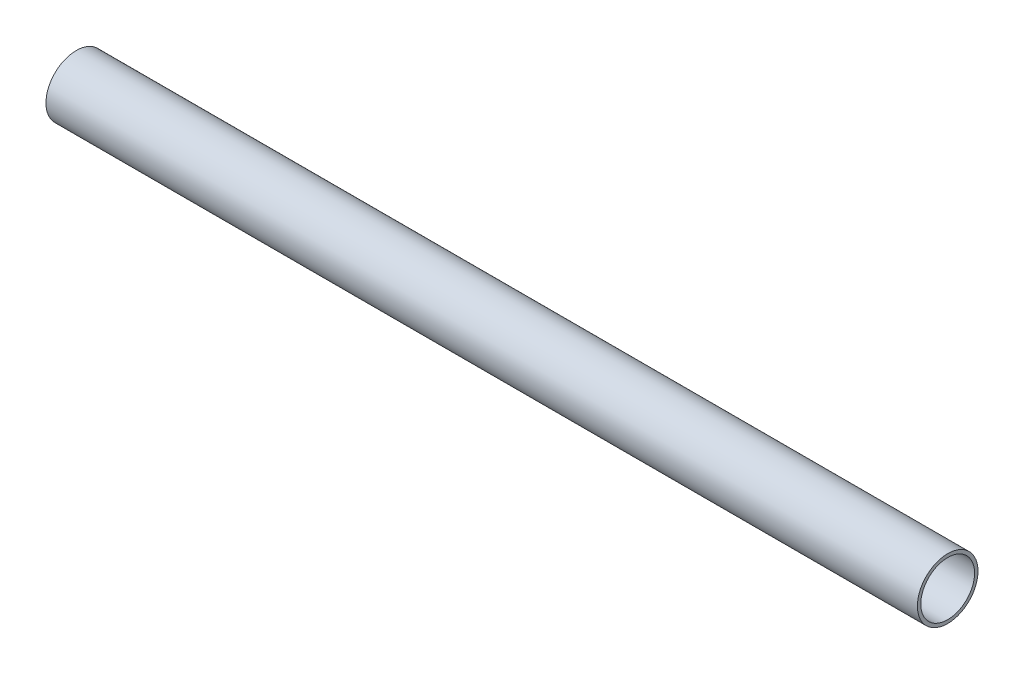
ISO-10303-21;
HEADER;
FILE_DESCRIPTION(('STEP AP214'),'2;1');
FILE_NAME('part.step','',(''),(''),'','','');
FILE_SCHEMA(('AUTOMOTIVE_DESIGN { 1 0 10303 214 1 1 1 1 }'));
ENDSEC;
DATA;
#1=APPLICATION_CONTEXT('core data for automotive mechanical design processes');
#2=APPLICATION_PROTOCOL_DEFINITION('international standard','automotive_design',2000,#1);
#3=PRODUCT_CONTEXT('',#1,'mechanical');
#4=PRODUCT('Part','Part','',(#3));
#5=PRODUCT_RELATED_PRODUCT_CATEGORY('part','',(#4));
#6=PRODUCT_DEFINITION_FORMATION('','',#4);
#7=PRODUCT_DEFINITION_CONTEXT('part definition',#1,'design');
#8=PRODUCT_DEFINITION('design','',#6,#7);
#9=PRODUCT_DEFINITION_SHAPE('','',#8);
#10=(LENGTH_UNIT() NAMED_UNIT(*) SI_UNIT(.MILLI.,.METRE.));
#11=(NAMED_UNIT(*) PLANE_ANGLE_UNIT() SI_UNIT($,.RADIAN.));
#12=(NAMED_UNIT(*) SI_UNIT($,.STERADIAN.) SOLID_ANGLE_UNIT());
#13=UNCERTAINTY_MEASURE_WITH_UNIT(LENGTH_MEASURE(1.E-05),#10,'distance_accuracy_value','');
#14=(GEOMETRIC_REPRESENTATION_CONTEXT(3) GLOBAL_UNCERTAINTY_ASSIGNED_CONTEXT((#13)) GLOBAL_UNIT_ASSIGNED_CONTEXT((#10,
#11,#12)) REPRESENTATION_CONTEXT('',''));
#15=CARTESIAN_POINT('',(0.,0.,0.));
#16=DIRECTION('',(0.,0.,1.));
#17=DIRECTION('',(1.,0.,0.));
#18=AXIS2_PLACEMENT_3D('',#15,#16,#17);
#19=CARTESIAN_POINT('',(115.,920.,-1946.51325703663));
#20=DIRECTION('',(-1.,0.,0.));
#21=DIRECTION('',(0.,0.,1.));
#22=AXIS2_PLACEMENT_3D('',#19,#20,#21);
#23=CYLINDRICAL_SURFACE('',#22,7.1);
#24=CARTESIAN_POINT('',(115.,920.,-1946.51325703663));
#25=DIRECTION('',(1.,0.,0.));
#26=DIRECTION('',(0.,0.,-1.));
#27=AXIS2_PLACEMENT_3D('',#24,#25,#26);
#28=CIRCLE('',#27,7.1);
#29=CARTESIAN_POINT('',(115.,920.,-1953.61325703663));
#30=VERTEX_POINT('',#29);
#31=EDGE_CURVE('E46',#30,#30,#28,.T.);
#32=ORIENTED_EDGE('',*,*,#31,.T.);
#33=EDGE_LOOP('',(#32));
#34=FACE_BOUND('',#33,.T.);
#35=CARTESIAN_POINT('',(-115.,920.,-1946.51325703663));
#36=DIRECTION('',(1.,0.,0.));
#37=DIRECTION('',(0.,0.,-1.));
#38=AXIS2_PLACEMENT_3D('',#35,#36,#37);
#39=CIRCLE('',#38,7.1);
#40=CARTESIAN_POINT('',(-115.,920.,-1953.61325703663));
#41=VERTEX_POINT('',#40);
#42=EDGE_CURVE('E52',#41,#41,#39,.T.);
#43=ORIENTED_EDGE('',*,*,#42,.F.);
#44=EDGE_LOOP('',(#43));
#45=FACE_BOUND('',#44,.T.);
#46=ADVANCED_FACE('F39',(#34,#45),#23,.F.);
#47=CARTESIAN_POINT('',(115.,920.,-1946.51325703663));
#48=DIRECTION('',(-1.,0.,0.));
#49=DIRECTION('',(0.,0.,1.));
#50=AXIS2_PLACEMENT_3D('',#47,#48,#49);
#51=CYLINDRICAL_SURFACE('',#50,8.);
#52=CARTESIAN_POINT('',(115.,920.,-1946.51325703663));
#53=DIRECTION('',(1.,0.,0.));
#54=DIRECTION('',(0.,0.,-1.));
#55=AXIS2_PLACEMENT_3D('',#52,#53,#54);
#56=CIRCLE('',#55,8.);
#57=CARTESIAN_POINT('',(115.,920.,-1954.51325703663));
#58=VERTEX_POINT('',#57);
#59=EDGE_CURVE('E10',#58,#58,#56,.T.);
#60=ORIENTED_EDGE('',*,*,#59,.F.);
#61=EDGE_LOOP('',(#60));
#62=FACE_BOUND('',#61,.T.);
#63=CARTESIAN_POINT('',(-115.,920.,-1946.51325703663));
#64=DIRECTION('',(1.,0.,0.));
#65=DIRECTION('',(0.,0.,-1.));
#66=AXIS2_PLACEMENT_3D('',#63,#64,#65);
#67=CIRCLE('',#66,8.);
#68=CARTESIAN_POINT('',(-115.,920.,-1954.51325703663));
#69=VERTEX_POINT('',#68);
#70=EDGE_CURVE('E42',#69,#69,#67,.T.);
#71=ORIENTED_EDGE('',*,*,#70,.T.);
#72=EDGE_LOOP('',(#71));
#73=FACE_BOUND('',#72,.T.);
#74=ADVANCED_FACE('F59',(#62,#73),#51,.T.);
#75=CARTESIAN_POINT('',(115.,920.,-1946.51325703663));
#76=DIRECTION('',(1.,0.,0.));
#77=DIRECTION('',(0.,0.,-1.));
#78=AXIS2_PLACEMENT_3D('',#75,#76,#77);
#79=PLANE('',#78);
#80=ORIENTED_EDGE('',*,*,#31,.F.);
#81=EDGE_LOOP('',(#80));
#82=FACE_BOUND('',#81,.T.);
#83=ORIENTED_EDGE('',*,*,#59,.T.);
#84=EDGE_LOOP('',(#83));
#85=FACE_BOUND('',#84,.T.);
#86=ADVANCED_FACE('F63',(#82,#85),#79,.T.);
#87=CARTESIAN_POINT('',(-115.,920.,-1946.51325703663));
#88=DIRECTION('',(1.,0.,0.));
#89=DIRECTION('',(0.,0.,-1.));
#90=AXIS2_PLACEMENT_3D('',#87,#88,#89);
#91=PLANE('',#90);
#92=ORIENTED_EDGE('',*,*,#42,.T.);
#93=EDGE_LOOP('',(#92));
#94=FACE_BOUND('',#93,.T.);
#95=ORIENTED_EDGE('',*,*,#70,.F.);
#96=EDGE_LOOP('',(#95));
#97=FACE_BOUND('',#96,.T.);
#98=ADVANCED_FACE('F61',(#94,#97),#91,.F.);
#99=CLOSED_SHELL('',(#46,#74,#86,#98));
#100=MANIFOLD_SOLID_BREP('B2',#99);
#101=ADVANCED_BREP_SHAPE_REPRESENTATION('',(#18,#100),#14);
#102=SHAPE_DEFINITION_REPRESENTATION(#9,#101);
ENDSEC;
END-ISO-10303-21;
